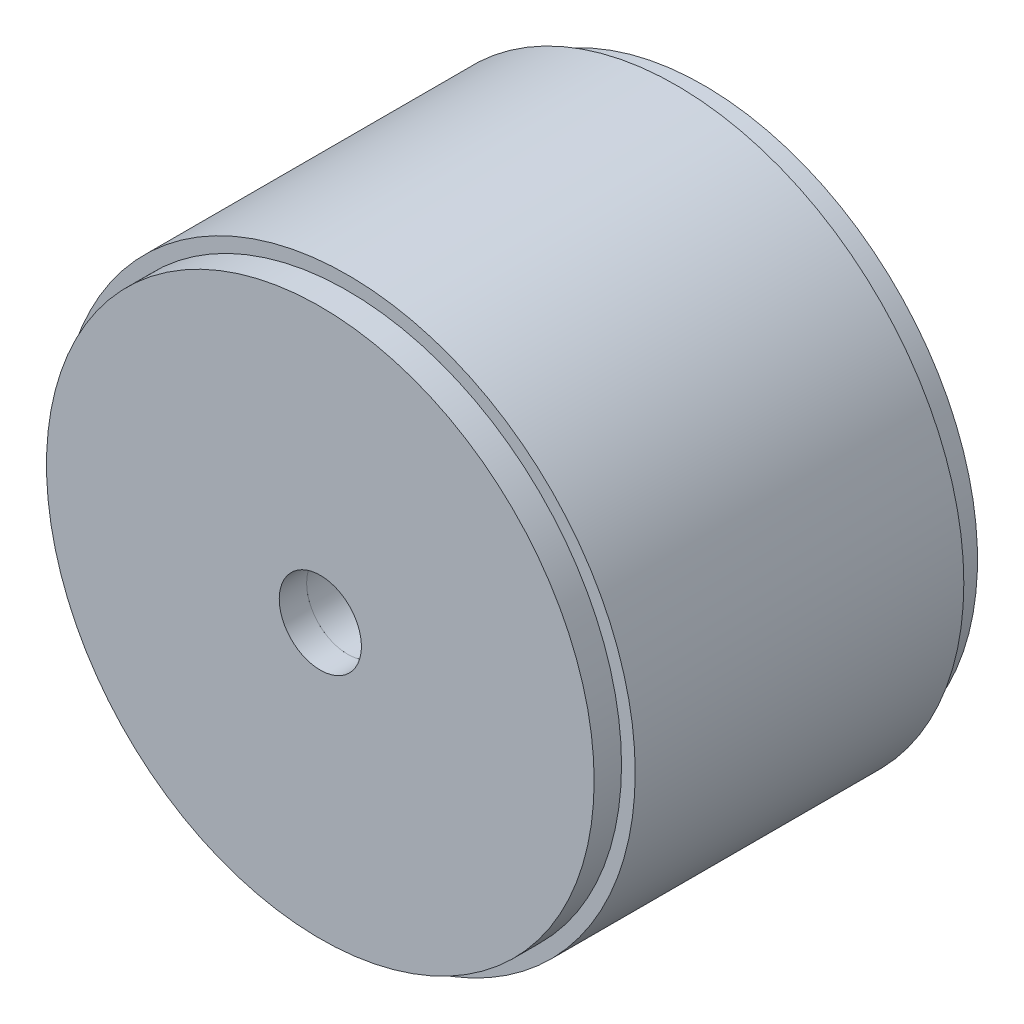
ISO-10303-21;
HEADER;
FILE_DESCRIPTION(('STEP AP214'),'2;1');
FILE_NAME('part.step','',(''),(''),'','','');
FILE_SCHEMA(('AUTOMOTIVE_DESIGN { 1 0 10303 214 1 1 1 1 }'));
ENDSEC;
DATA;
#1=APPLICATION_CONTEXT('core data for automotive mechanical design processes');
#2=APPLICATION_PROTOCOL_DEFINITION('international standard','automotive_design',2000,#1);
#3=PRODUCT_CONTEXT('',#1,'mechanical');
#4=PRODUCT('Part','Part','',(#3));
#5=PRODUCT_RELATED_PRODUCT_CATEGORY('part','',(#4));
#6=PRODUCT_DEFINITION_FORMATION('','',#4);
#7=PRODUCT_DEFINITION_CONTEXT('part definition',#1,'design');
#8=PRODUCT_DEFINITION('design','',#6,#7);
#9=PRODUCT_DEFINITION_SHAPE('','',#8);
#10=(LENGTH_UNIT() NAMED_UNIT(*) SI_UNIT(.MILLI.,.METRE.));
#11=(NAMED_UNIT(*) PLANE_ANGLE_UNIT() SI_UNIT($,.RADIAN.));
#12=(NAMED_UNIT(*) SI_UNIT($,.STERADIAN.) SOLID_ANGLE_UNIT());
#13=UNCERTAINTY_MEASURE_WITH_UNIT(LENGTH_MEASURE(1.E-05),#10,'distance_accuracy_value','');
#14=(GEOMETRIC_REPRESENTATION_CONTEXT(3) GLOBAL_UNCERTAINTY_ASSIGNED_CONTEXT((#13)) GLOBAL_UNIT_ASSIGNED_CONTEXT((#10,
#11,#12)) REPRESENTATION_CONTEXT('',''));
#15=CARTESIAN_POINT('',(0.,0.,0.));
#16=DIRECTION('',(0.,0.,1.));
#17=DIRECTION('',(1.,0.,0.));
#18=AXIS2_PLACEMENT_3D('',#15,#16,#17);
#19=CARTESIAN_POINT('',(0.,0.,-1.));
#20=DIRECTION('',(0.,0.,1.));
#21=DIRECTION('',(1.,0.,0.));
#22=AXIS2_PLACEMENT_3D('',#19,#20,#21);
#23=CYLINDRICAL_SURFACE('',#22,10.);
#24=CARTESIAN_POINT('',(0.,0.,-1.));
#25=DIRECTION('',(0.,0.,-1.));
#26=DIRECTION('',(-1.,0.,0.));
#27=AXIS2_PLACEMENT_3D('',#24,#25,#26);
#28=CIRCLE('',#27,10.);
#29=CARTESIAN_POINT('',(-10.,0.,-1.));
#30=VERTEX_POINT('',#29);
#31=EDGE_CURVE('E11',#30,#30,#28,.T.);
#32=ORIENTED_EDGE('',*,*,#31,.F.);
#33=EDGE_LOOP('',(#32));
#34=FACE_BOUND('',#33,.T.);
#35=CARTESIAN_POINT('',(0.,0.,0.));
#36=DIRECTION('',(0.,0.,-1.));
#37=DIRECTION('',(-1.,0.,0.));
#38=AXIS2_PLACEMENT_3D('',#35,#36,#37);
#39=CIRCLE('',#38,10.);
#40=CARTESIAN_POINT('',(-10.,0.,0.));
#41=VERTEX_POINT('',#40);
#42=EDGE_CURVE('E53',#41,#41,#39,.T.);
#43=ORIENTED_EDGE('',*,*,#42,.T.);
#44=EDGE_LOOP('',(#43));
#45=FACE_BOUND('',#44,.T.);
#46=ADVANCED_FACE('F46',(#34,#45),#23,.T.);
#47=CARTESIAN_POINT('',(0.,0.,-1.));
#48=DIRECTION('',(0.,0.,-1.));
#49=DIRECTION('',(-1.,0.,0.));
#50=AXIS2_PLACEMENT_3D('',#47,#48,#49);
#51=PLANE('',#50);
#52=CARTESIAN_POINT('',(0.,0.,-1.));
#53=DIRECTION('',(0.,0.,-1.));
#54=DIRECTION('',(-1.,0.,0.));
#55=AXIS2_PLACEMENT_3D('',#52,#53,#54);
#56=CIRCLE('',#55,1.5);
#57=CARTESIAN_POINT('',(-1.5,0.,-1.));
#58=VERTEX_POINT('',#57);
#59=EDGE_CURVE('E59',#58,#58,#56,.T.);
#60=ORIENTED_EDGE('',*,*,#59,.F.);
#61=EDGE_LOOP('',(#60));
#62=FACE_BOUND('',#61,.T.);
#63=ORIENTED_EDGE('',*,*,#31,.T.);
#64=EDGE_LOOP('',(#63));
#65=FACE_BOUND('',#64,.T.);
#66=ADVANCED_FACE('F75',(#62,#65),#51,.T.);
#67=CARTESIAN_POINT('',(0.,0.,0.));
#68=DIRECTION('',(0.,0.,-1.));
#69=DIRECTION('',(-1.,0.,0.));
#70=AXIS2_PLACEMENT_3D('',#67,#68,#69);
#71=PLANE('',#70);
#72=CARTESIAN_POINT('',(0.,0.,0.));
#73=DIRECTION('',(0.,0.,-1.));
#74=DIRECTION('',(-1.,0.,0.));
#75=AXIS2_PLACEMENT_3D('',#72,#73,#74);
#76=CIRCLE('',#75,1.5);
#77=CARTESIAN_POINT('',(-1.5,0.,0.));
#78=VERTEX_POINT('',#77);
#79=EDGE_CURVE('E49',#78,#78,#76,.T.);
#80=ORIENTED_EDGE('',*,*,#79,.T.);
#81=EDGE_LOOP('',(#80));
#82=FACE_BOUND('',#81,.T.);
#83=ORIENTED_EDGE('',*,*,#42,.F.);
#84=EDGE_LOOP('',(#83));
#85=FACE_BOUND('',#84,.T.);
#86=ADVANCED_FACE('F66',(#82,#85),#71,.F.);
#87=CARTESIAN_POINT('',(0.,0.,13.));
#88=DIRECTION('',(0.,0.,-1.));
#89=DIRECTION('',(-1.,0.,0.));
#90=AXIS2_PLACEMENT_3D('',#87,#88,#89);
#91=CYLINDRICAL_SURFACE('',#90,1.5);
#92=ORIENTED_EDGE('',*,*,#59,.T.);
#93=EDGE_LOOP('',(#92));
#94=FACE_BOUND('',#93,.T.);
#95=ORIENTED_EDGE('',*,*,#79,.F.);
#96=EDGE_LOOP('',(#95));
#97=FACE_BOUND('',#96,.T.);
#98=ADVANCED_FACE('F69',(#94,#97),#91,.F.);
#99=CLOSED_SHELL('',(#46,#66,#86,#98));
#100=MANIFOLD_SOLID_BREP('B2',#99);
#101=CARTESIAN_POINT('',(0.,0.,13.));
#102=DIRECTION('',(0.,0.,-1.));
#103=DIRECTION('',(-1.,0.,0.));
#104=AXIS2_PLACEMENT_3D('',#101,#102,#103);
#105=CYLINDRICAL_SURFACE('',#104,10.);
#106=CARTESIAN_POINT('',(0.,0.,13.));
#107=DIRECTION('',(0.,0.,1.));
#108=DIRECTION('',(1.,0.,0.));
#109=AXIS2_PLACEMENT_3D('',#106,#107,#108);
#110=CIRCLE('',#109,10.);
#111=CARTESIAN_POINT('',(10.,0.,13.));
#112=VERTEX_POINT('',#111);
#113=EDGE_CURVE('E45',#112,#112,#110,.T.);
#114=ORIENTED_EDGE('',*,*,#113,.F.);
#115=EDGE_LOOP('',(#114));
#116=FACE_BOUND('',#115,.T.);
#117=CARTESIAN_POINT('',(0.,0.,12.));
#118=DIRECTION('',(0.,0.,1.));
#119=DIRECTION('',(1.,0.,0.));
#120=AXIS2_PLACEMENT_3D('',#117,#118,#119);
#121=CIRCLE('',#120,10.);
#122=CARTESIAN_POINT('',(10.,0.,12.));
#123=VERTEX_POINT('',#122);
#124=EDGE_CURVE('E130',#123,#123,#121,.T.);
#125=ORIENTED_EDGE('',*,*,#124,.T.);
#126=EDGE_LOOP('',(#125));
#127=FACE_BOUND('',#126,.T.);
#128=ADVANCED_FACE('F123',(#116,#127),#105,.T.);
#129=CARTESIAN_POINT('',(0.,0.,13.));
#130=DIRECTION('',(0.,0.,1.));
#131=DIRECTION('',(1.,0.,0.));
#132=AXIS2_PLACEMENT_3D('',#129,#130,#131);
#133=PLANE('',#132);
#134=CARTESIAN_POINT('',(0.,0.,13.));
#135=DIRECTION('',(0.,0.,-1.));
#136=DIRECTION('',(-1.,0.,0.));
#137=AXIS2_PLACEMENT_3D('',#134,#135,#136);
#138=CIRCLE('',#137,1.5);
#139=CARTESIAN_POINT('',(-1.5,0.,13.));
#140=VERTEX_POINT('',#139);
#141=EDGE_CURVE('E136',#140,#140,#138,.T.);
#142=ORIENTED_EDGE('',*,*,#141,.T.);
#143=EDGE_LOOP('',(#142));
#144=FACE_BOUND('',#143,.T.);
#145=ORIENTED_EDGE('',*,*,#113,.T.);
#146=EDGE_LOOP('',(#145));
#147=FACE_BOUND('',#146,.T.);
#148=ADVANCED_FACE('F153',(#144,#147),#133,.T.);
#149=CARTESIAN_POINT('',(0.,0.,12.));
#150=DIRECTION('',(0.,0.,1.));
#151=DIRECTION('',(1.,0.,0.));
#152=AXIS2_PLACEMENT_3D('',#149,#150,#151);
#153=PLANE('',#152);
#154=CARTESIAN_POINT('',(0.,0.,12.));
#155=DIRECTION('',(0.,0.,1.));
#156=DIRECTION('',(1.,0.,0.));
#157=AXIS2_PLACEMENT_3D('',#154,#155,#156);
#158=CIRCLE('',#157,1.5);
#159=CARTESIAN_POINT('',(1.5,0.,12.));
#160=VERTEX_POINT('',#159);
#161=EDGE_CURVE('E126',#160,#160,#158,.T.);
#162=ORIENTED_EDGE('',*,*,#161,.T.);
#163=EDGE_LOOP('',(#162));
#164=FACE_BOUND('',#163,.T.);
#165=ORIENTED_EDGE('',*,*,#124,.F.);
#166=EDGE_LOOP('',(#165));
#167=FACE_BOUND('',#166,.T.);
#168=ADVANCED_FACE('F143',(#164,#167),#153,.F.);
#169=CARTESIAN_POINT('',(0.,0.,13.));
#170=DIRECTION('',(0.,0.,-1.));
#171=DIRECTION('',(-1.,0.,0.));
#172=AXIS2_PLACEMENT_3D('',#169,#170,#171);
#173=CYLINDRICAL_SURFACE('',#172,1.5);
#174=ORIENTED_EDGE('',*,*,#141,.F.);
#175=EDGE_LOOP('',(#174));
#176=FACE_BOUND('',#175,.T.);
#177=ORIENTED_EDGE('',*,*,#161,.F.);
#178=EDGE_LOOP('',(#177));
#179=FACE_BOUND('',#178,.T.);
#180=ADVANCED_FACE('F146',(#176,#179),#173,.F.);
#181=CLOSED_SHELL('',(#128,#148,#168,#180));
#182=MANIFOLD_SOLID_BREP('B6',#181);
#183=CARTESIAN_POINT('',(0.,0.,12.));
#184=DIRECTION('',(0.,0.,-1.));
#185=DIRECTION('',(-1.,0.,0.));
#186=AXIS2_PLACEMENT_3D('',#183,#184,#185);
#187=CYLINDRICAL_SURFACE('',#186,10.5);
#188=CARTESIAN_POINT('',(0.,0.,12.));
#189=DIRECTION('',(0.,0.,1.));
#190=DIRECTION('',(1.,0.,0.));
#191=AXIS2_PLACEMENT_3D('',#188,#189,#190);
#192=CIRCLE('',#191,10.5);
#193=CARTESIAN_POINT('',(10.5,0.,12.));
#194=VERTEX_POINT('',#193);
#195=EDGE_CURVE('E122',#194,#194,#192,.T.);
#196=ORIENTED_EDGE('',*,*,#195,.F.);
#197=EDGE_LOOP('',(#196));
#198=FACE_BOUND('',#197,.T.);
#199=CARTESIAN_POINT('',(0.,0.,0.));
#200=DIRECTION('',(0.,0.,1.));
#201=DIRECTION('',(1.,0.,0.));
#202=AXIS2_PLACEMENT_3D('',#199,#200,#201);
#203=CIRCLE('',#202,10.5);
#204=CARTESIAN_POINT('',(10.5,0.,0.));
#205=VERTEX_POINT('',#204);
#206=EDGE_CURVE('E200',#205,#205,#203,.T.);
#207=ORIENTED_EDGE('',*,*,#206,.T.);
#208=EDGE_LOOP('',(#207));
#209=FACE_BOUND('',#208,.T.);
#210=ADVANCED_FACE('F193',(#198,#209),#187,.T.);
#211=CARTESIAN_POINT('',(0.,0.,12.));
#212=DIRECTION('',(0.,0.,1.));
#213=DIRECTION('',(1.,0.,0.));
#214=AXIS2_PLACEMENT_3D('',#211,#212,#213);
#215=PLANE('',#214);
#216=CARTESIAN_POINT('',(0.,0.,12.));
#217=DIRECTION('',(0.,0.,1.));
#218=DIRECTION('',(1.,0.,0.));
#219=AXIS2_PLACEMENT_3D('',#216,#217,#218);
#220=CIRCLE('',#219,1.5);
#221=CARTESIAN_POINT('',(1.5,0.,12.));
#222=VERTEX_POINT('',#221);
#223=EDGE_CURVE('E205',#222,#222,#220,.T.);
#224=ORIENTED_EDGE('',*,*,#223,.F.);
#225=EDGE_LOOP('',(#224));
#226=FACE_BOUND('',#225,.T.);
#227=ORIENTED_EDGE('',*,*,#195,.T.);
#228=EDGE_LOOP('',(#227));
#229=FACE_BOUND('',#228,.T.);
#230=ADVANCED_FACE('F222',(#226,#229),#215,.T.);
#231=CARTESIAN_POINT('',(0.,0.,0.));
#232=DIRECTION('',(0.,0.,1.));
#233=DIRECTION('',(1.,0.,0.));
#234=AXIS2_PLACEMENT_3D('',#231,#232,#233);
#235=PLANE('',#234);
#236=CARTESIAN_POINT('',(0.,0.,0.));
#237=DIRECTION('',(0.,0.,1.));
#238=DIRECTION('',(1.,0.,0.));
#239=AXIS2_PLACEMENT_3D('',#236,#237,#238);
#240=CIRCLE('',#239,1.5);
#241=CARTESIAN_POINT('',(1.5,0.,0.));
#242=VERTEX_POINT('',#241);
#243=EDGE_CURVE('E196',#242,#242,#240,.T.);
#244=ORIENTED_EDGE('',*,*,#243,.T.);
#245=EDGE_LOOP('',(#244));
#246=FACE_BOUND('',#245,.T.);
#247=ORIENTED_EDGE('',*,*,#206,.F.);
#248=EDGE_LOOP('',(#247));
#249=FACE_BOUND('',#248,.T.);
#250=ADVANCED_FACE('F213',(#246,#249),#235,.F.);
#251=CARTESIAN_POINT('',(0.,0.,13.));
#252=DIRECTION('',(0.,0.,-1.));
#253=DIRECTION('',(-1.,0.,0.));
#254=AXIS2_PLACEMENT_3D('',#251,#252,#253);
#255=CYLINDRICAL_SURFACE('',#254,1.5);
#256=ORIENTED_EDGE('',*,*,#223,.T.);
#257=EDGE_LOOP('',(#256));
#258=FACE_BOUND('',#257,.T.);
#259=ORIENTED_EDGE('',*,*,#243,.F.);
#260=EDGE_LOOP('',(#259));
#261=FACE_BOUND('',#260,.T.);
#262=ADVANCED_FACE('F216',(#258,#261),#255,.F.);
#263=CLOSED_SHELL('',(#210,#230,#250,#262));
#264=MANIFOLD_SOLID_BREP('B40',#263);
#265=ADVANCED_BREP_SHAPE_REPRESENTATION('',(#18,#100,#182,#264),#14);
#266=SHAPE_DEFINITION_REPRESENTATION(#9,#265);
ENDSEC;
END-ISO-10303-21;
